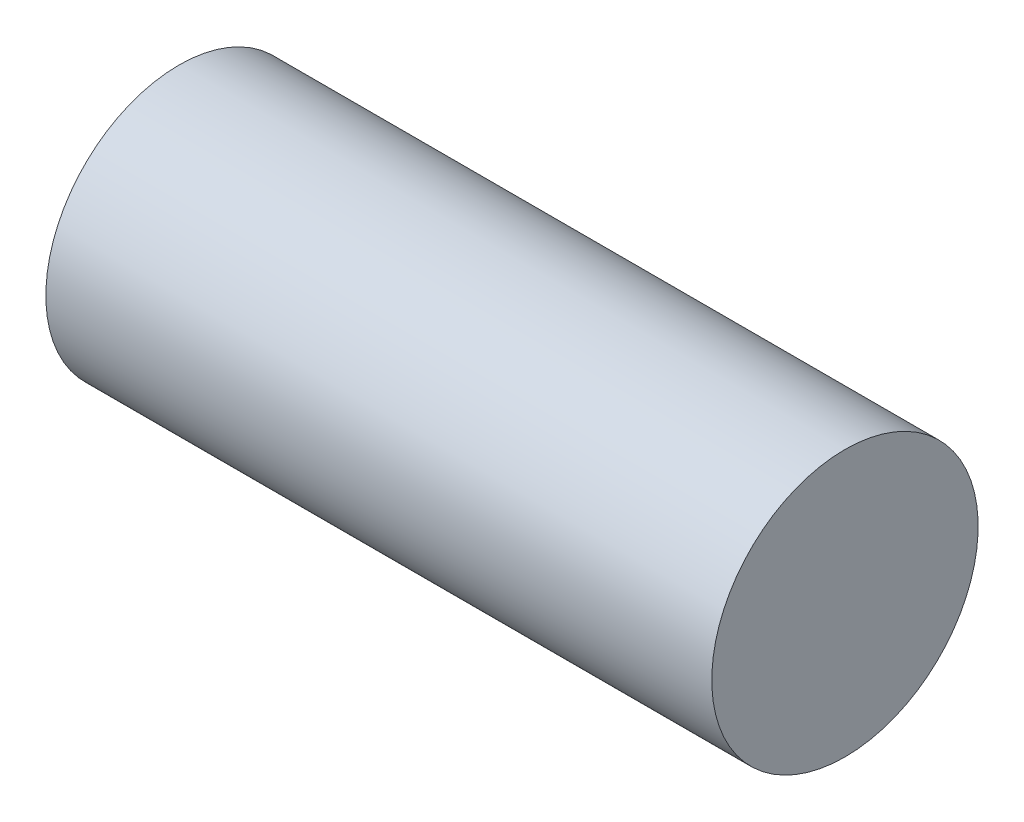
ISO-10303-21;
HEADER;
FILE_DESCRIPTION(('STEP AP214'),'2;1');
FILE_NAME('part.step','',(''),(''),'','','');
FILE_SCHEMA(('AUTOMOTIVE_DESIGN { 1 0 10303 214 1 1 1 1 }'));
ENDSEC;
DATA;
#1=APPLICATION_CONTEXT('core data for automotive mechanical design processes');
#2=APPLICATION_PROTOCOL_DEFINITION('international standard','automotive_design',2000,#1);
#3=PRODUCT_CONTEXT('',#1,'mechanical');
#4=PRODUCT('Part','Part','',(#3));
#5=PRODUCT_RELATED_PRODUCT_CATEGORY('part','',(#4));
#6=PRODUCT_DEFINITION_FORMATION('','',#4);
#7=PRODUCT_DEFINITION_CONTEXT('part definition',#1,'design');
#8=PRODUCT_DEFINITION('design','',#6,#7);
#9=PRODUCT_DEFINITION_SHAPE('','',#8);
#10=(LENGTH_UNIT() NAMED_UNIT(*) SI_UNIT(.MILLI.,.METRE.));
#11=(NAMED_UNIT(*) PLANE_ANGLE_UNIT() SI_UNIT($,.RADIAN.));
#12=(NAMED_UNIT(*) SI_UNIT($,.STERADIAN.) SOLID_ANGLE_UNIT());
#13=UNCERTAINTY_MEASURE_WITH_UNIT(LENGTH_MEASURE(1.E-05),#10,'distance_accuracy_value','');
#14=(GEOMETRIC_REPRESENTATION_CONTEXT(3) GLOBAL_UNCERTAINTY_ASSIGNED_CONTEXT((#13)) GLOBAL_UNIT_ASSIGNED_CONTEXT((#10,
#11,#12)) REPRESENTATION_CONTEXT('',''));
#15=CARTESIAN_POINT('',(0.,0.,0.));
#16=DIRECTION('',(0.,0.,1.));
#17=DIRECTION('',(1.,0.,0.));
#18=AXIS2_PLACEMENT_3D('',#15,#16,#17);
#19=CARTESIAN_POINT('',(0.,0.,0.));
#20=DIRECTION('',(1.,0.,0.));
#21=DIRECTION('',(0.,0.,-1.));
#22=AXIS2_PLACEMENT_3D('',#19,#20,#21);
#23=PLANE('',#22);
#24=CARTESIAN_POINT('',(0.,0.,0.));
#25=DIRECTION('',(-1.,0.,0.));
#26=DIRECTION('',(0.,0.,1.));
#27=AXIS2_PLACEMENT_3D('',#24,#25,#26);
#28=CIRCLE('',#27,5.);
#29=CARTESIAN_POINT('',(0.,5.,-3.58979302984161E-08));
#30=VERTEX_POINT('',#29);
#31=CARTESIAN_POINT('',(0.,5.,0.));
#32=VERTEX_POINT('',#31);
#33=EDGE_CURVE('E11',#30,#32,#28,.T.);
#34=ORIENTED_EDGE('',*,*,#33,.T.);
#35=DIRECTION('',(0.,-1.,0.));
#36=VECTOR('',#35,1.);
#37=CARTESIAN_POINT('',(0.,0.,0.));
#38=LINE('',#37,#36);
#39=CARTESIAN_POINT('',(0.,0.,0.));
#40=VERTEX_POINT('',#39);
#41=EDGE_CURVE('E55',#32,#40,#38,.T.);
#42=ORIENTED_EDGE('',*,*,#41,.T.);
#43=DIRECTION('',(0.,-1.,7.17958605968322E-09));
#44=VECTOR('',#43,1.);
#45=CARTESIAN_POINT('',(0.,0.,0.));
#46=LINE('',#45,#44);
#47=EDGE_CURVE('E76',#30,#40,#46,.T.);
#48=ORIENTED_EDGE('',*,*,#47,.F.);
#49=EDGE_LOOP('',(#34,#42,#48));
#50=FACE_BOUND('',#49,.T.);
#51=ADVANCED_FACE('F39',(#50),#23,.F.);
#52=CARTESIAN_POINT('',(0.,0.,0.));
#53=DIRECTION('',(-1.,0.,0.));
#54=DIRECTION('',(0.,0.,1.));
#55=AXIS2_PLACEMENT_3D('',#52,#53,#54);
#56=CYLINDRICAL_SURFACE('',#55,5.);
#57=CARTESIAN_POINT('',(25.,0.,0.));
#58=DIRECTION('',(-1.,0.,0.));
#59=DIRECTION('',(0.,0.,1.));
#60=AXIS2_PLACEMENT_3D('',#57,#58,#59);
#61=CIRCLE('',#60,5.);
#62=CARTESIAN_POINT('',(25.,5.,-3.58979302984161E-08));
#63=VERTEX_POINT('',#62);
#64=CARTESIAN_POINT('',(25.,5.,0.));
#65=VERTEX_POINT('',#64);
#66=EDGE_CURVE('E46',#63,#65,#61,.T.);
#67=ORIENTED_EDGE('',*,*,#66,.T.);
#68=DIRECTION('',(-1.,0.,0.));
#69=VECTOR('',#68,1.);
#70=CARTESIAN_POINT('',(0.,5.,0.));
#71=LINE('',#70,#69);
#72=EDGE_CURVE('E74',#65,#32,#71,.T.);
#73=ORIENTED_EDGE('',*,*,#72,.T.);
#74=ORIENTED_EDGE('',*,*,#33,.F.);
#75=DIRECTION('',(-1.,0.,0.));
#76=VECTOR('',#75,1.);
#77=CARTESIAN_POINT('',(0.,5.,-3.58979302984161E-08));
#78=LINE('',#77,#76);
#79=EDGE_CURVE('E73',#63,#30,#78,.T.);
#80=ORIENTED_EDGE('',*,*,#79,.F.);
#81=EDGE_LOOP('',(#67,#73,#74,#80));
#82=FACE_BOUND('',#81,.T.);
#83=ADVANCED_FACE('F71',(#82),#56,.T.);
#84=CARTESIAN_POINT('',(25.,5.,-3.58979302984161E-08));
#85=DIRECTION('',(-1.,0.,0.));
#86=DIRECTION('',(0.,0.,1.));
#87=AXIS2_PLACEMENT_3D('',#84,#85,#86);
#88=PLANE('',#87);
#89=DIRECTION('',(0.,1.,-7.17958605968322E-09));
#90=VECTOR('',#89,1.);
#91=CARTESIAN_POINT('',(25.,5.,-3.58979302984161E-08));
#92=LINE('',#91,#90);
#93=CARTESIAN_POINT('',(25.,0.,0.));
#94=VERTEX_POINT('',#93);
#95=EDGE_CURVE('E85',#94,#63,#92,.T.);
#96=ORIENTED_EDGE('',*,*,#95,.F.);
#97=DIRECTION('',(0.,1.,0.));
#98=VECTOR('',#97,1.);
#99=CARTESIAN_POINT('',(25.,5.,0.));
#100=LINE('',#99,#98);
#101=EDGE_CURVE('E79',#94,#65,#100,.T.);
#102=ORIENTED_EDGE('',*,*,#101,.T.);
#103=ORIENTED_EDGE('',*,*,#66,.F.);
#104=EDGE_LOOP('',(#96,#102,#103));
#105=FACE_BOUND('',#104,.T.);
#106=ADVANCED_FACE('F83',(#105),#88,.F.);
#107=CARTESIAN_POINT('',(0.,0.,0.));
#108=DIRECTION('',(0.,-7.17958605968322E-09,-1.));
#109=DIRECTION('',(-1.,0.,0.));
#110=AXIS2_PLACEMENT_3D('',#107,#108,#109);
#111=PLANE('',#110);
#112=DIRECTION('',(1.,0.,0.));
#113=VECTOR('',#112,1.);
#114=CARTESIAN_POINT('',(25.,0.,0.));
#115=LINE('',#114,#113);
#116=EDGE_CURVE('E88',#40,#94,#115,.T.);
#117=ORIENTED_EDGE('',*,*,#116,.T.);
#118=ORIENTED_EDGE('',*,*,#95,.T.);
#119=ORIENTED_EDGE('',*,*,#79,.T.);
#120=ORIENTED_EDGE('',*,*,#47,.T.);
#121=EDGE_LOOP('',(#117,#118,#119,#120));
#122=FACE_BOUND('',#121,.T.);
#123=ADVANCED_FACE('F94',(#122),#111,.F.);
#124=CARTESIAN_POINT('',(0.,0.,0.));
#125=DIRECTION('',(0.,0.,-1.));
#126=DIRECTION('',(-1.,0.,0.));
#127=AXIS2_PLACEMENT_3D('',#124,#125,#126);
#128=PLANE('',#127);
#129=ORIENTED_EDGE('',*,*,#116,.F.);
#130=ORIENTED_EDGE('',*,*,#41,.F.);
#131=ORIENTED_EDGE('',*,*,#72,.F.);
#132=ORIENTED_EDGE('',*,*,#101,.F.);
#133=EDGE_LOOP('',(#129,#130,#131,#132));
#134=FACE_BOUND('',#133,.T.);
#135=ADVANCED_FACE('F86',(#134),#128,.T.);
#136=CLOSED_SHELL('',(#51,#83,#106,#123,#135));
#137=MANIFOLD_SOLID_BREP('B2',#136);
#138=ADVANCED_BREP_SHAPE_REPRESENTATION('',(#18,#137),#14);
#139=SHAPE_DEFINITION_REPRESENTATION(#9,#138);
ENDSEC;
END-ISO-10303-21;
